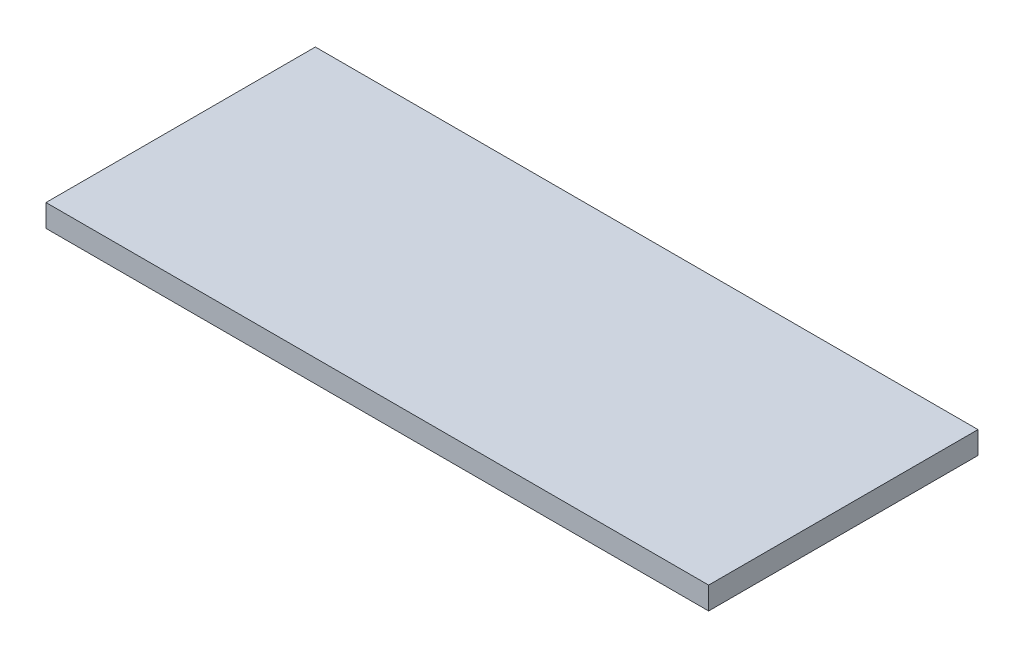
ISO-10303-21;
HEADER;
FILE_DESCRIPTION(('STEP AP214'),'2;1');
FILE_NAME('part.step','',(''),(''),'','','');
FILE_SCHEMA(('AUTOMOTIVE_DESIGN { 1 0 10303 214 1 1 1 1 }'));
ENDSEC;
DATA;
#1=APPLICATION_CONTEXT('core data for automotive mechanical design processes');
#2=APPLICATION_PROTOCOL_DEFINITION('international standard','automotive_design',2000,#1);
#3=PRODUCT_CONTEXT('',#1,'mechanical');
#4=PRODUCT('Part','Part','',(#3));
#5=PRODUCT_RELATED_PRODUCT_CATEGORY('part','',(#4));
#6=PRODUCT_DEFINITION_FORMATION('','',#4);
#7=PRODUCT_DEFINITION_CONTEXT('part definition',#1,'design');
#8=PRODUCT_DEFINITION('design','',#6,#7);
#9=PRODUCT_DEFINITION_SHAPE('','',#8);
#10=(LENGTH_UNIT() NAMED_UNIT(*) SI_UNIT(.MILLI.,.METRE.));
#11=(NAMED_UNIT(*) PLANE_ANGLE_UNIT() SI_UNIT($,.RADIAN.));
#12=(NAMED_UNIT(*) SI_UNIT($,.STERADIAN.) SOLID_ANGLE_UNIT());
#13=UNCERTAINTY_MEASURE_WITH_UNIT(LENGTH_MEASURE(1.E-05),#10,'distance_accuracy_value','');
#14=(GEOMETRIC_REPRESENTATION_CONTEXT(3) GLOBAL_UNCERTAINTY_ASSIGNED_CONTEXT((#13)) GLOBAL_UNIT_ASSIGNED_CONTEXT((#10,
#11,#12)) REPRESENTATION_CONTEXT('',''));
#15=CARTESIAN_POINT('',(0.,0.,0.));
#16=DIRECTION('',(0.,0.,1.));
#17=DIRECTION('',(1.,0.,0.));
#18=AXIS2_PLACEMENT_3D('',#15,#16,#17);
#19=CARTESIAN_POINT('',(93.726,6.35,-38.1));
#20=DIRECTION('',(-1.,0.,0.));
#21=DIRECTION('',(0.,0.,1.));
#22=AXIS2_PLACEMENT_3D('',#19,#20,#21);
#23=PLANE('',#22);
#24=DIRECTION('',(0.,0.,-1.));
#25=VECTOR('',#24,1.);
#26=CARTESIAN_POINT('',(93.726,0.,-38.1));
#27=LINE('',#26,#25);
#28=CARTESIAN_POINT('',(93.726,0.,38.1));
#29=VERTEX_POINT('',#28);
#30=CARTESIAN_POINT('',(93.726,0.,-38.1));
#31=VERTEX_POINT('',#30);
#32=EDGE_CURVE('E96',#29,#31,#27,.T.);
#33=ORIENTED_EDGE('',*,*,#32,.T.);
#34=DIRECTION('',(0.,-1.,0.));
#35=VECTOR('',#34,1.);
#36=CARTESIAN_POINT('',(93.726,6.35,-38.1));
#37=LINE('',#36,#35);
#38=CARTESIAN_POINT('',(93.726,6.35,-38.1));
#39=VERTEX_POINT('',#38);
#40=EDGE_CURVE('E11',#39,#31,#37,.T.);
#41=ORIENTED_EDGE('',*,*,#40,.F.);
#42=DIRECTION('',(0.,0.,-1.));
#43=VECTOR('',#42,1.);
#44=CARTESIAN_POINT('',(93.726,6.35,-38.1));
#45=LINE('',#44,#43);
#46=CARTESIAN_POINT('',(93.726,6.35,38.1));
#47=VERTEX_POINT('',#46);
#48=EDGE_CURVE('E84',#47,#39,#45,.T.);
#49=ORIENTED_EDGE('',*,*,#48,.F.);
#50=DIRECTION('',(0.,-1.,0.));
#51=VECTOR('',#50,1.);
#52=CARTESIAN_POINT('',(93.726,6.35,38.1));
#53=LINE('',#52,#51);
#54=EDGE_CURVE('E92',#47,#29,#53,.T.);
#55=ORIENTED_EDGE('',*,*,#54,.T.);
#56=EDGE_LOOP('',(#33,#41,#49,#55));
#57=FACE_BOUND('',#56,.T.);
#58=ADVANCED_FACE('F33',(#57),#23,.F.);
#59=CARTESIAN_POINT('',(-93.726,6.35,-38.1));
#60=DIRECTION('',(0.,0.,1.));
#61=DIRECTION('',(1.,0.,0.));
#62=AXIS2_PLACEMENT_3D('',#59,#60,#61);
#63=PLANE('',#62);
#64=DIRECTION('',(-1.,0.,0.));
#65=VECTOR('',#64,1.);
#66=CARTESIAN_POINT('',(-93.726,0.,-38.1));
#67=LINE('',#66,#65);
#68=CARTESIAN_POINT('',(-93.726,0.,-38.1));
#69=VERTEX_POINT('',#68);
#70=EDGE_CURVE('E88',#31,#69,#67,.T.);
#71=ORIENTED_EDGE('',*,*,#70,.T.);
#72=DIRECTION('',(0.,-1.,0.));
#73=VECTOR('',#72,1.);
#74=CARTESIAN_POINT('',(-93.726,6.35,-38.1));
#75=LINE('',#74,#73);
#76=CARTESIAN_POINT('',(-93.726,6.35,-38.1));
#77=VERTEX_POINT('',#76);
#78=EDGE_CURVE('E41',#77,#69,#75,.T.);
#79=ORIENTED_EDGE('',*,*,#78,.F.);
#80=DIRECTION('',(-1.,0.,0.));
#81=VECTOR('',#80,1.);
#82=CARTESIAN_POINT('',(-93.726,6.35,-38.1));
#83=LINE('',#82,#81);
#84=EDGE_CURVE('E79',#39,#77,#83,.T.);
#85=ORIENTED_EDGE('',*,*,#84,.F.);
#86=ORIENTED_EDGE('',*,*,#40,.T.);
#87=EDGE_LOOP('',(#71,#79,#85,#86));
#88=FACE_BOUND('',#87,.T.);
#89=ADVANCED_FACE('F87',(#88),#63,.F.);
#90=CARTESIAN_POINT('',(-93.726,6.35,-38.1));
#91=DIRECTION('',(1.,0.,0.));
#92=DIRECTION('',(0.,0.,-1.));
#93=AXIS2_PLACEMENT_3D('',#90,#91,#92);
#94=PLANE('',#93);
#95=DIRECTION('',(0.,0.,1.));
#96=VECTOR('',#95,1.);
#97=CARTESIAN_POINT('',(-93.726,0.,-38.1));
#98=LINE('',#97,#96);
#99=CARTESIAN_POINT('',(-93.726,0.,38.1));
#100=VERTEX_POINT('',#99);
#101=EDGE_CURVE('E66',#69,#100,#98,.T.);
#102=ORIENTED_EDGE('',*,*,#101,.T.);
#103=DIRECTION('',(0.,-1.,0.));
#104=VECTOR('',#103,1.);
#105=CARTESIAN_POINT('',(-93.726,6.35,38.1));
#106=LINE('',#105,#104);
#107=CARTESIAN_POINT('',(-93.726,6.35,38.1));
#108=VERTEX_POINT('',#107);
#109=EDGE_CURVE('E89',#108,#100,#106,.T.);
#110=ORIENTED_EDGE('',*,*,#109,.F.);
#111=DIRECTION('',(0.,0.,1.));
#112=VECTOR('',#111,1.);
#113=CARTESIAN_POINT('',(-93.726,6.35,-38.1));
#114=LINE('',#113,#112);
#115=EDGE_CURVE('E82',#77,#108,#114,.T.);
#116=ORIENTED_EDGE('',*,*,#115,.F.);
#117=ORIENTED_EDGE('',*,*,#78,.T.);
#118=EDGE_LOOP('',(#102,#110,#116,#117));
#119=FACE_BOUND('',#118,.T.);
#120=ADVANCED_FACE('F90',(#119),#94,.F.);
#121=CARTESIAN_POINT('',(-93.726,6.35,38.1));
#122=DIRECTION('',(0.,0.,-1.));
#123=DIRECTION('',(-1.,0.,0.));
#124=AXIS2_PLACEMENT_3D('',#121,#122,#123);
#125=PLANE('',#124);
#126=DIRECTION('',(1.,0.,0.));
#127=VECTOR('',#126,1.);
#128=CARTESIAN_POINT('',(-93.726,0.,38.1));
#129=LINE('',#128,#127);
#130=EDGE_CURVE('E72',#100,#29,#129,.T.);
#131=ORIENTED_EDGE('',*,*,#130,.T.);
#132=ORIENTED_EDGE('',*,*,#54,.F.);
#133=DIRECTION('',(1.,0.,0.));
#134=VECTOR('',#133,1.);
#135=CARTESIAN_POINT('',(-93.726,6.35,38.1));
#136=LINE('',#135,#134);
#137=EDGE_CURVE('E49',#108,#47,#136,.T.);
#138=ORIENTED_EDGE('',*,*,#137,.F.);
#139=ORIENTED_EDGE('',*,*,#109,.T.);
#140=EDGE_LOOP('',(#131,#132,#138,#139));
#141=FACE_BOUND('',#140,.T.);
#142=ADVANCED_FACE('F103',(#141),#125,.F.);
#143=CARTESIAN_POINT('',(0.,6.35,0.));
#144=DIRECTION('',(0.,1.,0.));
#145=DIRECTION('',(0.,0.,1.));
#146=AXIS2_PLACEMENT_3D('',#143,#144,#145);
#147=PLANE('',#146);
#148=ORIENTED_EDGE('',*,*,#48,.T.);
#149=ORIENTED_EDGE('',*,*,#84,.T.);
#150=ORIENTED_EDGE('',*,*,#115,.T.);
#151=ORIENTED_EDGE('',*,*,#137,.T.);
#152=EDGE_LOOP('',(#148,#149,#150,#151));
#153=FACE_BOUND('',#152,.T.);
#154=ADVANCED_FACE('F80',(#153),#147,.T.);
#155=CARTESIAN_POINT('',(0.,0.,0.));
#156=DIRECTION('',(0.,1.,0.));
#157=DIRECTION('',(0.,0.,1.));
#158=AXIS2_PLACEMENT_3D('',#155,#156,#157);
#159=PLANE('',#158);
#160=ORIENTED_EDGE('',*,*,#32,.F.);
#161=ORIENTED_EDGE('',*,*,#130,.F.);
#162=ORIENTED_EDGE('',*,*,#101,.F.);
#163=ORIENTED_EDGE('',*,*,#70,.F.);
#164=EDGE_LOOP('',(#160,#161,#162,#163));
#165=FACE_BOUND('',#164,.T.);
#166=ADVANCED_FACE('F106',(#165),#159,.F.);
#167=CLOSED_SHELL('',(#58,#89,#120,#142,#154,#166));
#168=MANIFOLD_SOLID_BREP('B2',#167);
#169=ADVANCED_BREP_SHAPE_REPRESENTATION('',(#18,#168),#14);
#170=SHAPE_DEFINITION_REPRESENTATION(#9,#169);
ENDSEC;
END-ISO-10303-21;
